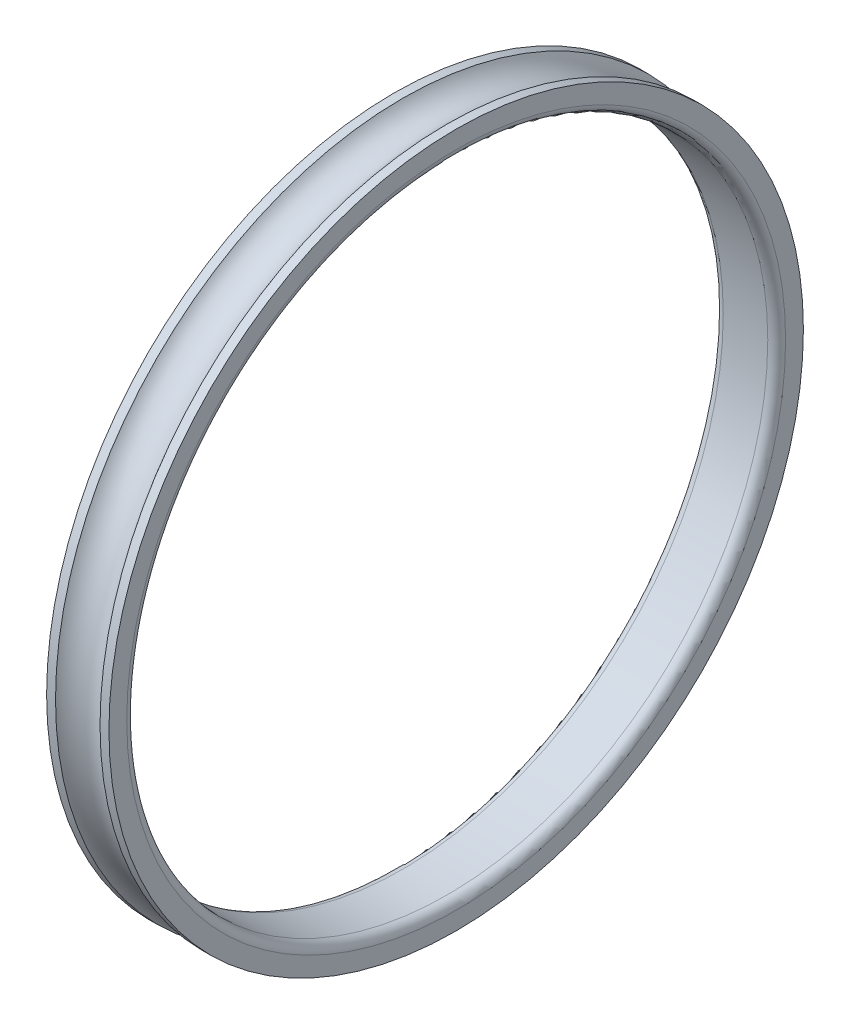
ISO-10303-21;
HEADER;
FILE_DESCRIPTION(('STEP AP214'),'2;1');
FILE_NAME('part.step','',(''),(''),'','','');
FILE_SCHEMA(('AUTOMOTIVE_DESIGN { 1 0 10303 214 1 1 1 1 }'));
ENDSEC;
DATA;
#1=APPLICATION_CONTEXT('core data for automotive mechanical design processes');
#2=APPLICATION_PROTOCOL_DEFINITION('international standard','automotive_design',2000,#1);
#3=PRODUCT_CONTEXT('',#1,'mechanical');
#4=PRODUCT('Part','Part','',(#3));
#5=PRODUCT_RELATED_PRODUCT_CATEGORY('part','',(#4));
#6=PRODUCT_DEFINITION_FORMATION('','',#4);
#7=PRODUCT_DEFINITION_CONTEXT('part definition',#1,'design');
#8=PRODUCT_DEFINITION('design','',#6,#7);
#9=PRODUCT_DEFINITION_SHAPE('','',#8);
#10=(LENGTH_UNIT() NAMED_UNIT(*) SI_UNIT(.MILLI.,.METRE.));
#11=(NAMED_UNIT(*) PLANE_ANGLE_UNIT() SI_UNIT($,.RADIAN.));
#12=(NAMED_UNIT(*) SI_UNIT($,.STERADIAN.) SOLID_ANGLE_UNIT());
#13=UNCERTAINTY_MEASURE_WITH_UNIT(LENGTH_MEASURE(1.E-05),#10,'distance_accuracy_value','');
#14=(GEOMETRIC_REPRESENTATION_CONTEXT(3) GLOBAL_UNCERTAINTY_ASSIGNED_CONTEXT((#13)) GLOBAL_UNIT_ASSIGNED_CONTEXT((#10,
#11,#12)) REPRESENTATION_CONTEXT('',''));
#15=CARTESIAN_POINT('',(0.,0.,0.));
#16=DIRECTION('',(0.,0.,1.));
#17=DIRECTION('',(1.,0.,0.));
#18=AXIS2_PLACEMENT_3D('',#15,#16,#17);
#19=CARTESIAN_POINT('',(44.4499999999996,495.3,0.));
#20=DIRECTION('',(1.,0.,0.));
#21=DIRECTION('',(0.,0.,-1.));
#22=AXIS2_PLACEMENT_3D('',#19,#20,#21);
#23=PLANE('',#22);
#24=CARTESIAN_POINT('',(44.4499999999996,0.,0.));
#25=DIRECTION('',(1.,0.,0.));
#26=DIRECTION('',(0.,0.,-1.));
#27=AXIS2_PLACEMENT_3D('',#24,#25,#26);
#28=CIRCLE('',#27,495.3);
#29=CARTESIAN_POINT('',(44.4499999999996,0.,-495.3));
#30=VERTEX_POINT('',#29);
#31=EDGE_CURVE('E10',#30,#30,#28,.T.);
#32=ORIENTED_EDGE('',*,*,#31,.T.);
#33=EDGE_LOOP('',(#32));
#34=FACE_BOUND('',#33,.T.);
#35=CARTESIAN_POINT('',(44.4499999999996,0.,0.));
#36=DIRECTION('',(1.,0.,0.));
#37=DIRECTION('',(0.,0.,-1.));
#38=AXIS2_PLACEMENT_3D('',#35,#36,#37);
#39=CIRCLE('',#38,469.9);
#40=CARTESIAN_POINT('',(44.4499999999996,0.,-469.9));
#41=VERTEX_POINT('',#40);
#42=EDGE_CURVE('E61',#41,#41,#39,.T.);
#43=ORIENTED_EDGE('',*,*,#42,.F.);
#44=EDGE_LOOP('',(#43));
#45=FACE_BOUND('',#44,.T.);
#46=ADVANCED_FACE('F33',(#34,#45),#23,.T.);
#47=CARTESIAN_POINT('',(0.,0.,0.));
#48=DIRECTION('',(1.,0.,0.));
#49=DIRECTION('',(0.,0.,-1.));
#50=AXIS2_PLACEMENT_3D('',#47,#48,#49);
#51=CYLINDRICAL_SURFACE('',#50,495.3);
#52=CARTESIAN_POINT('',(31.7499999999996,0.,0.));
#53=DIRECTION('',(1.,0.,0.));
#54=DIRECTION('',(0.,0.,-1.));
#55=AXIS2_PLACEMENT_3D('',#52,#53,#54);
#56=CIRCLE('',#55,495.3);
#57=CARTESIAN_POINT('',(31.7499999999996,0.,-495.3));
#58=VERTEX_POINT('',#57);
#59=EDGE_CURVE('E39',#58,#58,#56,.T.);
#60=ORIENTED_EDGE('',*,*,#59,.T.);
#61=EDGE_LOOP('',(#60));
#62=FACE_BOUND('',#61,.T.);
#63=ORIENTED_EDGE('',*,*,#31,.F.);
#64=EDGE_LOOP('',(#63));
#65=FACE_BOUND('',#64,.T.);
#66=ADVANCED_FACE('F69',(#62,#65),#51,.T.);
#67=CARTESIAN_POINT('',(0.,0.,0.));
#68=DIRECTION('',(1.,0.,0.));
#69=DIRECTION('',(0.,0.,-1.));
#70=AXIS2_PLACEMENT_3D('',#67,#68,#69);
#71=TOROIDAL_SURFACE('',#70,516.360567418758,38.1000000000003);
#72=CARTESIAN_POINT('',(-31.7499999999997,0.,0.));
#73=DIRECTION('',(1.,0.,0.));
#74=DIRECTION('',(0.,0.,-1.));
#75=AXIS2_PLACEMENT_3D('',#72,#73,#74);
#76=CIRCLE('',#75,495.3);
#77=CARTESIAN_POINT('',(-31.7499999999997,0.,-495.3));
#78=VERTEX_POINT('',#77);
#79=EDGE_CURVE('E43',#78,#78,#76,.T.);
#80=ORIENTED_EDGE('',*,*,#79,.T.);
#81=EDGE_LOOP('',(#80));
#82=FACE_BOUND('',#81,.T.);
#83=ORIENTED_EDGE('',*,*,#59,.F.);
#84=EDGE_LOOP('',(#83));
#85=FACE_BOUND('',#84,.T.);
#86=ADVANCED_FACE('F73',(#82,#85),#71,.F.);
#87=CARTESIAN_POINT('',(0.,0.,0.));
#88=DIRECTION('',(1.,0.,0.));
#89=DIRECTION('',(0.,0.,-1.));
#90=AXIS2_PLACEMENT_3D('',#87,#88,#89);
#91=CYLINDRICAL_SURFACE('',#90,495.3);
#92=CARTESIAN_POINT('',(-44.4499999999997,0.,0.));
#93=DIRECTION('',(1.,0.,0.));
#94=DIRECTION('',(0.,0.,-1.));
#95=AXIS2_PLACEMENT_3D('',#92,#93,#94);
#96=CIRCLE('',#95,495.3);
#97=CARTESIAN_POINT('',(-44.4499999999997,0.,-495.3));
#98=VERTEX_POINT('',#97);
#99=EDGE_CURVE('E47',#98,#98,#96,.T.);
#100=ORIENTED_EDGE('',*,*,#99,.T.);
#101=EDGE_LOOP('',(#100));
#102=FACE_BOUND('',#101,.T.);
#103=ORIENTED_EDGE('',*,*,#79,.F.);
#104=EDGE_LOOP('',(#103));
#105=FACE_BOUND('',#104,.T.);
#106=ADVANCED_FACE('F77',(#102,#105),#91,.T.);
#107=CARTESIAN_POINT('',(-44.4499999999997,495.3,0.));
#108=DIRECTION('',(-1.,0.,0.));
#109=DIRECTION('',(0.,0.,1.));
#110=AXIS2_PLACEMENT_3D('',#107,#108,#109);
#111=PLANE('',#110);
#112=CARTESIAN_POINT('',(-44.4499999999996,0.,0.));
#113=DIRECTION('',(1.,0.,0.));
#114=DIRECTION('',(0.,0.,-1.));
#115=AXIS2_PLACEMENT_3D('',#112,#113,#114);
#116=CIRCLE('',#115,469.9);
#117=CARTESIAN_POINT('',(-44.4499999999996,0.,-469.9));
#118=VERTEX_POINT('',#117);
#119=EDGE_CURVE('E52',#118,#118,#116,.T.);
#120=ORIENTED_EDGE('',*,*,#119,.T.);
#121=EDGE_LOOP('',(#120));
#122=FACE_BOUND('',#121,.T.);
#123=ORIENTED_EDGE('',*,*,#99,.F.);
#124=EDGE_LOOP('',(#123));
#125=FACE_BOUND('',#124,.T.);
#126=ADVANCED_FACE('F84',(#122,#125),#111,.T.);
#127=CARTESIAN_POINT('',(-31.7499999999997,0.,0.));
#128=DIRECTION('',(1.,0.,0.));
#129=DIRECTION('',(0.,0.,-1.));
#130=AXIS2_PLACEMENT_3D('',#127,#128,#129);
#131=TOROIDAL_SURFACE('',#130,469.9,12.6999999999999);
#132=CARTESIAN_POINT('',(-31.7499999999996,0.,0.));
#133=DIRECTION('',(1.,0.,0.));
#134=DIRECTION('',(0.,0.,-1.));
#135=AXIS2_PLACEMENT_3D('',#132,#133,#134);
#136=CIRCLE('',#135,457.2);
#137=CARTESIAN_POINT('',(-31.7499999999996,0.,-457.2));
#138=VERTEX_POINT('',#137);
#139=EDGE_CURVE('E55',#138,#138,#136,.T.);
#140=ORIENTED_EDGE('',*,*,#139,.T.);
#141=EDGE_LOOP('',(#140));
#142=FACE_BOUND('',#141,.T.);
#143=ORIENTED_EDGE('',*,*,#119,.F.);
#144=EDGE_LOOP('',(#143));
#145=FACE_BOUND('',#144,.T.);
#146=ADVANCED_FACE('F88',(#142,#145),#131,.T.);
#147=CARTESIAN_POINT('',(0.,0.,0.));
#148=DIRECTION('',(1.,0.,0.));
#149=DIRECTION('',(0.,0.,-1.));
#150=AXIS2_PLACEMENT_3D('',#147,#148,#149);
#151=CYLINDRICAL_SURFACE('',#150,457.2);
#152=CARTESIAN_POINT('',(31.7500000000004,0.,0.));
#153=DIRECTION('',(1.,0.,0.));
#154=DIRECTION('',(0.,0.,-1.));
#155=AXIS2_PLACEMENT_3D('',#152,#153,#154);
#156=CIRCLE('',#155,457.2);
#157=CARTESIAN_POINT('',(31.7500000000004,0.,-457.2));
#158=VERTEX_POINT('',#157);
#159=EDGE_CURVE('E58',#158,#158,#156,.T.);
#160=ORIENTED_EDGE('',*,*,#159,.T.);
#161=EDGE_LOOP('',(#160));
#162=FACE_BOUND('',#161,.T.);
#163=ORIENTED_EDGE('',*,*,#139,.F.);
#164=EDGE_LOOP('',(#163));
#165=FACE_BOUND('',#164,.T.);
#166=ADVANCED_FACE('F92',(#162,#165),#151,.F.);
#167=CARTESIAN_POINT('',(31.7499999999997,0.,0.));
#168=DIRECTION('',(1.,0.,0.));
#169=DIRECTION('',(0.,0.,-1.));
#170=AXIS2_PLACEMENT_3D('',#167,#168,#169);
#171=TOROIDAL_SURFACE('',#170,469.9,12.6999999999999);
#172=ORIENTED_EDGE('',*,*,#42,.T.);
#173=EDGE_LOOP('',(#172));
#174=FACE_BOUND('',#173,.T.);
#175=ORIENTED_EDGE('',*,*,#159,.F.);
#176=EDGE_LOOP('',(#175));
#177=FACE_BOUND('',#176,.T.);
#178=ADVANCED_FACE('F65',(#174,#177),#171,.T.);
#179=CLOSED_SHELL('',(#46,#66,#86,#106,#126,#146,#166,#178));
#180=MANIFOLD_SOLID_BREP('B2',#179);
#181=ADVANCED_BREP_SHAPE_REPRESENTATION('',(#18,#180),#14);
#182=SHAPE_DEFINITION_REPRESENTATION(#9,#181);
ENDSEC;
END-ISO-10303-21;
